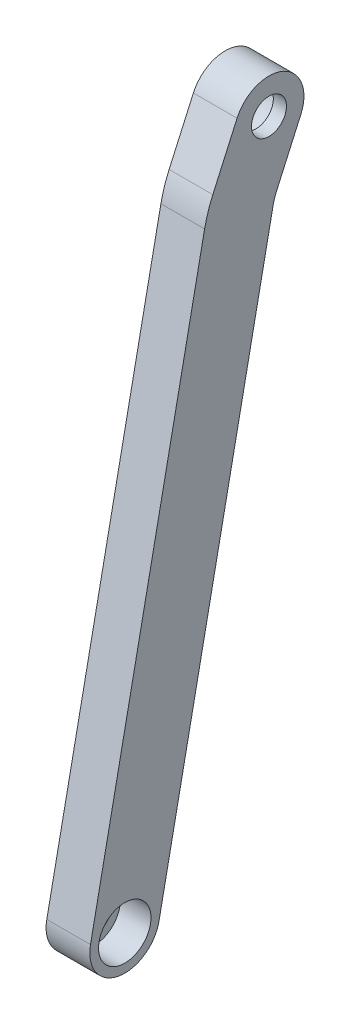
ISO-10303-21;
HEADER;
FILE_DESCRIPTION(('STEP AP214'),'2;1');
FILE_NAME('part.step','',(''),(''),'','','');
FILE_SCHEMA(('AUTOMOTIVE_DESIGN { 1 0 10303 214 1 1 1 1 }'));
ENDSEC;
DATA;
#1=APPLICATION_CONTEXT('core data for automotive mechanical design processes');
#2=APPLICATION_PROTOCOL_DEFINITION('international standard','automotive_design',2000,#1);
#3=PRODUCT_CONTEXT('',#1,'mechanical');
#4=PRODUCT('Part','Part','',(#3));
#5=PRODUCT_RELATED_PRODUCT_CATEGORY('part','',(#4));
#6=PRODUCT_DEFINITION_FORMATION('','',#4);
#7=PRODUCT_DEFINITION_CONTEXT('part definition',#1,'design');
#8=PRODUCT_DEFINITION('design','',#6,#7);
#9=PRODUCT_DEFINITION_SHAPE('','',#8);
#10=(LENGTH_UNIT() NAMED_UNIT(*) SI_UNIT(.MILLI.,.METRE.));
#11=(NAMED_UNIT(*) PLANE_ANGLE_UNIT() SI_UNIT($,.RADIAN.));
#12=(NAMED_UNIT(*) SI_UNIT($,.STERADIAN.) SOLID_ANGLE_UNIT());
#13=UNCERTAINTY_MEASURE_WITH_UNIT(LENGTH_MEASURE(1.E-05),#10,'distance_accuracy_value','');
#14=(GEOMETRIC_REPRESENTATION_CONTEXT(3) GLOBAL_UNCERTAINTY_ASSIGNED_CONTEXT((#13)) GLOBAL_UNIT_ASSIGNED_CONTEXT((#10,
#11,#12)) REPRESENTATION_CONTEXT('',''));
#15=CARTESIAN_POINT('',(0.,0.,0.));
#16=DIRECTION('',(0.,0.,1.));
#17=DIRECTION('',(1.,0.,0.));
#18=AXIS2_PLACEMENT_3D('',#15,#16,#17);
#19=CARTESIAN_POINT('',(-5.65000000000002,-1.63739818421656,-3.64951054065122));
#20=DIRECTION('',(0.,-0.40934954605414,-0.912377635162803));
#21=DIRECTION('',(0.,0.912377635162803,-0.40934954605414));
#22=AXIS2_PLACEMENT_3D('',#19,#20,#21);
#23=PLANE('',#22);
#24=DIRECTION('',(0.,0.912377635162803,-0.40934954605414));
#25=VECTOR('',#24,1.);
#26=CARTESIAN_POINT('',(-0.650000000000012,-1.63739818421656,-3.64951054065122));
#27=LINE('',#26,#25);
#28=CARTESIAN_POINT('',(-0.650000000000012,-7.82477172483871,-0.873468633761289));
#29=VERTEX_POINT('',#28);
#30=CARTESIAN_POINT('',(-0.650000000000012,-1.63739818421658,-3.64951054065121));
#31=VERTEX_POINT('',#30);
#32=EDGE_CURVE('E140',#29,#31,#27,.T.);
#33=ORIENTED_EDGE('',*,*,#32,.F.);
#34=DIRECTION('',(1.,0.,0.));
#35=VECTOR('',#34,1.);
#36=CARTESIAN_POINT('',(-5.65000000000002,-7.82477172483871,-0.873468633761289));
#37=LINE('',#36,#35);
#38=CARTESIAN_POINT('',(-5.65000000000002,-7.82477172483871,-0.873468633761289));
#39=VERTEX_POINT('',#38);
#40=EDGE_CURVE('E11',#39,#29,#37,.T.);
#41=ORIENTED_EDGE('',*,*,#40,.F.);
#42=DIRECTION('',(0.,0.912377635162803,-0.40934954605414));
#43=VECTOR('',#42,1.);
#44=CARTESIAN_POINT('',(-5.65000000000002,-1.63739818421656,-3.64951054065122));
#45=LINE('',#44,#43);
#46=CARTESIAN_POINT('',(-5.65000000000002,-1.63739818421658,-3.64951054065121));
#47=VERTEX_POINT('',#46);
#48=EDGE_CURVE('E159',#39,#47,#45,.T.);
#49=ORIENTED_EDGE('',*,*,#48,.T.);
#50=DIRECTION('',(1.,0.,0.));
#51=VECTOR('',#50,1.);
#52=CARTESIAN_POINT('',(-5.65000000000002,-1.63739818421658,-3.64951054065121));
#53=LINE('',#52,#51);
#54=EDGE_CURVE('E95',#47,#31,#53,.T.);
#55=ORIENTED_EDGE('',*,*,#54,.T.);
#56=EDGE_LOOP('',(#33,#41,#49,#55));
#57=FACE_BOUND('',#56,.T.);
#58=ADVANCED_FACE('F41',(#57),#23,.T.);
#59=CARTESIAN_POINT('',(-5.65000000000002,-10.2399340465581,-6.25649668122183));
#60=DIRECTION('',(1.,0.,0.));
#61=DIRECTION('',(0.,0.,-1.));
#62=AXIS2_PLACEMENT_3D('',#59,#60,#61);
#63=CYLINDRICAL_SURFACE('',#62,5.9);
#64=CARTESIAN_POINT('',(-0.650000000000012,-10.2399340465581,-6.25649668122183));
#65=DIRECTION('',(1.,0.,0.));
#66=DIRECTION('',(0.,0.,-1.));
#67=AXIS2_PLACEMENT_3D('',#64,#65,#66);
#68=CIRCLE('',#67,5.9);
#69=CARTESIAN_POINT('',(-0.650000000000012,-9.06756013629994,-0.474149457598367));
#70=VERTEX_POINT('',#69);
#71=EDGE_CURVE('E86',#29,#70,#68,.T.);
#72=ORIENTED_EDGE('',*,*,#71,.T.);
#73=DIRECTION('',(1.,0.,0.));
#74=VECTOR('',#73,1.);
#75=CARTESIAN_POINT('',(-5.65000000000002,-9.06756013629994,-0.474149457598367));
#76=LINE('',#75,#74);
#77=CARTESIAN_POINT('',(-5.65000000000002,-9.06756013629994,-0.474149457598367));
#78=VERTEX_POINT('',#77);
#79=EDGE_CURVE('E50',#78,#70,#76,.T.);
#80=ORIENTED_EDGE('',*,*,#79,.F.);
#81=CARTESIAN_POINT('',(-5.65000000000002,-10.2399340465581,-6.25649668122183));
#82=DIRECTION('',(1.,0.,0.));
#83=DIRECTION('',(0.,0.,-1.));
#84=AXIS2_PLACEMENT_3D('',#81,#82,#83);
#85=CIRCLE('',#84,5.9);
#86=EDGE_CURVE('E118',#39,#78,#85,.T.);
#87=ORIENTED_EDGE('',*,*,#86,.F.);
#88=ORIENTED_EDGE('',*,*,#40,.T.);
#89=EDGE_LOOP('',(#72,#80,#87,#88));
#90=FACE_BOUND('',#89,.T.);
#91=ADVANCED_FACE('F219',(#90),#63,.F.);
#92=CARTESIAN_POINT('',(-5.65000000000002,-0.450367647555779,-2.22128972136583));
#93=DIRECTION('',(0.,0.198707442416643,0.980058851461603));
#94=DIRECTION('',(0.,-0.980058851461603,0.198707442416643));
#95=AXIS2_PLACEMENT_3D('',#92,#93,#94);
#96=PLANE('',#95);
#97=DIRECTION('',(0.,-0.980058851461603,0.198707442416643));
#98=VECTOR('',#97,1.);
#99=CARTESIAN_POINT('',(-0.650000000000012,-0.450367647555779,-2.22128972136583));
#100=LINE('',#99,#98);
#101=CARTESIAN_POINT('',(-0.650000000000012,-73.4611369825203,12.5816817754848));
#102=VERTEX_POINT('',#101);
#103=EDGE_CURVE('E125',#70,#102,#100,.T.);
#104=ORIENTED_EDGE('',*,*,#103,.T.);
#105=DIRECTION('',(1.,0.,0.));
#106=VECTOR('',#105,1.);
#107=CARTESIAN_POINT('',(-5.65000000000002,-73.4611369825203,12.5816817754848));
#108=LINE('',#107,#106);
#109=CARTESIAN_POINT('',(-5.65000000000002,-73.4611369825203,12.5816817754848));
#110=VERTEX_POINT('',#109);
#111=EDGE_CURVE('E122',#110,#102,#108,.T.);
#112=ORIENTED_EDGE('',*,*,#111,.F.);
#113=DIRECTION('',(0.,-0.980058851461603,0.198707442416643));
#114=VECTOR('',#113,1.);
#115=CARTESIAN_POINT('',(-5.65000000000002,-0.450367647555779,-2.22128972136583));
#116=LINE('',#115,#114);
#117=EDGE_CURVE('E112',#78,#110,#116,.T.);
#118=ORIENTED_EDGE('',*,*,#117,.F.);
#119=ORIENTED_EDGE('',*,*,#79,.T.);
#120=EDGE_LOOP('',(#104,#112,#118,#119));
#121=FACE_BOUND('',#120,.T.);
#122=ADVANCED_FACE('F123',(#121),#96,.F.);
#123=CARTESIAN_POINT('',(-5.65000000000002,-72.6663072128537,16.5019171813312));
#124=DIRECTION('',(1.,0.,0.));
#125=DIRECTION('',(0.,0.,-1.));
#126=AXIS2_PLACEMENT_3D('',#123,#124,#125);
#127=CYLINDRICAL_SURFACE('',#126,4.);
#128=CARTESIAN_POINT('',(-0.650000000000012,-72.6663072128537,16.5019171813312));
#129=DIRECTION('',(1.,0.,0.));
#130=DIRECTION('',(0.,0.,-1.));
#131=AXIS2_PLACEMENT_3D('',#128,#129,#130);
#132=CIRCLE('',#131,4.);
#133=CARTESIAN_POINT('',(-0.650000000000012,-71.8714774431872,20.4221525871776));
#134=VERTEX_POINT('',#133);
#135=EDGE_CURVE('E156',#134,#102,#132,.T.);
#136=ORIENTED_EDGE('',*,*,#135,.F.);
#137=DIRECTION('',(1.,0.,0.));
#138=VECTOR('',#137,1.);
#139=CARTESIAN_POINT('',(-5.65000000000002,-71.8714774431872,20.4221525871776));
#140=LINE('',#139,#138);
#141=CARTESIAN_POINT('',(-5.65000000000002,-71.8714774431872,20.4221525871776));
#142=VERTEX_POINT('',#141);
#143=EDGE_CURVE('E129',#142,#134,#140,.T.);
#144=ORIENTED_EDGE('',*,*,#143,.F.);
#145=CARTESIAN_POINT('',(-5.65000000000002,-72.6663072128537,16.5019171813312));
#146=DIRECTION('',(1.,0.,0.));
#147=DIRECTION('',(0.,0.,-1.));
#148=AXIS2_PLACEMENT_3D('',#145,#146,#147);
#149=CIRCLE('',#148,4.);
#150=EDGE_CURVE('E117',#142,#110,#149,.T.);
#151=ORIENTED_EDGE('',*,*,#150,.T.);
#152=ORIENTED_EDGE('',*,*,#111,.T.);
#153=EDGE_LOOP('',(#136,#144,#151,#152));
#154=FACE_BOUND('',#153,.T.);
#155=ADVANCED_FACE('F131',(#154),#127,.T.);
#156=CARTESIAN_POINT('',(-5.65000000000002,1.13929189177736,5.619181090327));
#157=DIRECTION('',(0.,-0.198707442416643,-0.980058851461603));
#158=DIRECTION('',(0.,0.980058851461603,-0.198707442416643));
#159=AXIS2_PLACEMENT_3D('',#156,#157,#158);
#160=PLANE('',#159);
#161=DIRECTION('',(0.,0.980058851461603,-0.198707442416643));
#162=VECTOR('',#161,1.);
#163=CARTESIAN_POINT('',(-0.650000000000012,1.13929189177736,5.619181090327));
#164=LINE('',#163,#162);
#165=CARTESIAN_POINT('',(-0.650000000000012,-7.4779005969668,7.36632135409445));
#166=VERTEX_POINT('',#165);
#167=EDGE_CURVE('E153',#134,#166,#164,.T.);
#168=ORIENTED_EDGE('',*,*,#167,.T.);
#169=DIRECTION('',(1.,0.,0.));
#170=VECTOR('',#169,1.);
#171=CARTESIAN_POINT('',(-5.65000000000002,-7.4779005969668,7.36632135409445));
#172=LINE('',#171,#170);
#173=CARTESIAN_POINT('',(-5.65000000000002,-7.4779005969668,7.36632135409445));
#174=VERTEX_POINT('',#173);
#175=EDGE_CURVE('E163',#174,#166,#172,.T.);
#176=ORIENTED_EDGE('',*,*,#175,.F.);
#177=DIRECTION('',(0.,0.980058851461603,-0.198707442416643));
#178=VECTOR('',#177,1.);
#179=CARTESIAN_POINT('',(-5.65000000000002,1.13929189177736,5.619181090327));
#180=LINE('',#179,#178);
#181=EDGE_CURVE('E133',#142,#174,#180,.T.);
#182=ORIENTED_EDGE('',*,*,#181,.F.);
#183=ORIENTED_EDGE('',*,*,#143,.T.);
#184=EDGE_LOOP('',(#168,#176,#182,#183));
#185=FACE_BOUND('',#184,.T.);
#186=ADVANCED_FACE('F209',(#185),#160,.F.);
#187=CARTESIAN_POINT('',(-5.65000000000002,-10.2399340465581,-6.25649668122183));
#188=DIRECTION('',(1.,0.,0.));
#189=DIRECTION('',(0.,0.,-1.));
#190=AXIS2_PLACEMENT_3D('',#187,#188,#189);
#191=CYLINDRICAL_SURFACE('',#190,13.9);
#192=CARTESIAN_POINT('',(-0.650000000000012,-10.2399340465581,-6.25649668122183));
#193=DIRECTION('',(1.,0.,0.));
#194=DIRECTION('',(0.,0.,-1.));
#195=AXIS2_PLACEMENT_3D('',#192,#193,#194);
#196=CIRCLE('',#195,13.9);
#197=CARTESIAN_POINT('',(-0.650000000000012,-4.54997535640559,6.42555244754114));
#198=VERTEX_POINT('',#197);
#199=EDGE_CURVE('E150',#198,#166,#196,.T.);
#200=ORIENTED_EDGE('',*,*,#199,.F.);
#201=DIRECTION('',(1.,0.,0.));
#202=VECTOR('',#201,1.);
#203=CARTESIAN_POINT('',(-5.65000000000002,-4.54997535640559,6.42555244754114));
#204=LINE('',#203,#202);
#205=CARTESIAN_POINT('',(-5.65000000000002,-4.54997535640559,6.42555244754114));
#206=VERTEX_POINT('',#205);
#207=EDGE_CURVE('E165',#206,#198,#204,.T.);
#208=ORIENTED_EDGE('',*,*,#207,.F.);
#209=CARTESIAN_POINT('',(-5.65000000000002,-10.2399340465581,-6.25649668122183));
#210=DIRECTION('',(1.,0.,0.));
#211=DIRECTION('',(0.,0.,-1.));
#212=AXIS2_PLACEMENT_3D('',#209,#210,#211);
#213=CIRCLE('',#212,13.9);
#214=EDGE_CURVE('E135',#206,#174,#213,.T.);
#215=ORIENTED_EDGE('',*,*,#214,.T.);
#216=ORIENTED_EDGE('',*,*,#175,.T.);
#217=EDGE_LOOP('',(#200,#208,#215,#216));
#218=FACE_BOUND('',#217,.T.);
#219=ADVANCED_FACE('F198',(#218),#191,.T.);
#220=CARTESIAN_POINT('',(-5.65000000000002,1.63739818421656,3.64951054065121));
#221=DIRECTION('',(0.,0.40934954605414,0.912377635162804));
#222=DIRECTION('',(0.,-0.912377635162804,0.40934954605414));
#223=AXIS2_PLACEMENT_3D('',#220,#221,#222);
#224=PLANE('',#223);
#225=DIRECTION('',(0.,-0.912377635162804,0.40934954605414));
#226=VECTOR('',#225,1.);
#227=CARTESIAN_POINT('',(-0.650000000000012,1.63739818421656,3.64951054065121));
#228=LINE('',#227,#226);
#229=CARTESIAN_POINT('',(-0.650000000000012,1.63739818421655,3.64951054065121));
#230=VERTEX_POINT('',#229);
#231=EDGE_CURVE('E147',#230,#198,#228,.T.);
#232=ORIENTED_EDGE('',*,*,#231,.F.);
#233=DIRECTION('',(1.,0.,0.));
#234=VECTOR('',#233,1.);
#235=CARTESIAN_POINT('',(-5.65000000000002,1.63739818421655,3.64951054065121));
#236=LINE('',#235,#234);
#237=CARTESIAN_POINT('',(-5.65000000000002,1.63739818421655,3.64951054065121));
#238=VERTEX_POINT('',#237);
#239=EDGE_CURVE('E167',#238,#230,#236,.T.);
#240=ORIENTED_EDGE('',*,*,#239,.F.);
#241=DIRECTION('',(0.,-0.912377635162804,0.40934954605414));
#242=VECTOR('',#241,1.);
#243=CARTESIAN_POINT('',(-5.65000000000002,1.63739818421656,3.64951054065121));
#244=LINE('',#243,#242);
#245=EDGE_CURVE('E192',#238,#206,#244,.T.);
#246=ORIENTED_EDGE('',*,*,#245,.T.);
#247=ORIENTED_EDGE('',*,*,#207,.T.);
#248=EDGE_LOOP('',(#232,#240,#246,#247));
#249=FACE_BOUND('',#248,.T.);
#250=ADVANCED_FACE('F203',(#249),#224,.T.);
#251=CARTESIAN_POINT('',(-5.65000000000002,0.,0.));
#252=DIRECTION('',(1.,0.,0.));
#253=DIRECTION('',(0.,0.,-1.));
#254=AXIS2_PLACEMENT_3D('',#251,#252,#253);
#255=CYLINDRICAL_SURFACE('',#254,4.);
#256=CARTESIAN_POINT('',(-0.650000000000012,0.,0.));
#257=DIRECTION('',(1.,0.,0.));
#258=DIRECTION('',(0.,0.,-1.));
#259=AXIS2_PLACEMENT_3D('',#256,#257,#258);
#260=CIRCLE('',#259,4.);
#261=EDGE_CURVE('E143',#31,#230,#260,.T.);
#262=ORIENTED_EDGE('',*,*,#261,.F.);
#263=ORIENTED_EDGE('',*,*,#54,.F.);
#264=CARTESIAN_POINT('',(-5.65000000000002,0.,0.));
#265=DIRECTION('',(1.,0.,0.));
#266=DIRECTION('',(0.,0.,-1.));
#267=AXIS2_PLACEMENT_3D('',#264,#265,#266);
#268=CIRCLE('',#267,4.);
#269=EDGE_CURVE('E190',#47,#238,#268,.T.);
#270=ORIENTED_EDGE('',*,*,#269,.T.);
#271=ORIENTED_EDGE('',*,*,#239,.T.);
#272=EDGE_LOOP('',(#262,#263,#270,#271));
#273=FACE_BOUND('',#272,.T.);
#274=ADVANCED_FACE('F204',(#273),#255,.T.);
#275=CARTESIAN_POINT('',(-5.65000000000002,0.,0.));
#276=DIRECTION('',(1.,0.,0.));
#277=DIRECTION('',(0.,0.,-1.));
#278=AXIS2_PLACEMENT_3D('',#275,#276,#277);
#279=PLANE('',#278);
#280=CARTESIAN_POINT('',(-5.65000000000002,-72.6663072128537,16.5019171813312));
#281=DIRECTION('',(1.,0.,0.));
#282=DIRECTION('',(0.,0.,-1.));
#283=AXIS2_PLACEMENT_3D('',#280,#281,#282);
#284=CIRCLE('',#283,2.00000000000001);
#285=CARTESIAN_POINT('',(-5.65000000000002,-72.6663072128537,14.5019171813312));
#286=VERTEX_POINT('',#285);
#287=EDGE_CURVE('E264',#286,#286,#284,.T.);
#288=ORIENTED_EDGE('',*,*,#287,.T.);
#289=EDGE_LOOP('',(#288));
#290=FACE_BOUND('',#289,.T.);
#291=CARTESIAN_POINT('',(-5.65000000000002,0.,0.));
#292=DIRECTION('',(1.,0.,0.));
#293=DIRECTION('',(0.,0.,-1.));
#294=AXIS2_PLACEMENT_3D('',#291,#292,#293);
#295=CIRCLE('',#294,3.);
#296=CARTESIAN_POINT('',(-5.65000000000002,0.,3.));
#297=VERTEX_POINT('',#296);
#298=EDGE_CURVE('E171',#297,#297,#295,.T.);
#299=ORIENTED_EDGE('',*,*,#298,.T.);
#300=EDGE_LOOP('',(#299));
#301=FACE_BOUND('',#300,.T.);
#302=ORIENTED_EDGE('',*,*,#48,.F.);
#303=ORIENTED_EDGE('',*,*,#86,.T.);
#304=ORIENTED_EDGE('',*,*,#117,.T.);
#305=ORIENTED_EDGE('',*,*,#150,.F.);
#306=ORIENTED_EDGE('',*,*,#181,.T.);
#307=ORIENTED_EDGE('',*,*,#214,.F.);
#308=ORIENTED_EDGE('',*,*,#245,.F.);
#309=ORIENTED_EDGE('',*,*,#269,.F.);
#310=EDGE_LOOP('',(#302,#303,#304,#305,#306,#307,#308,#309));
#311=FACE_BOUND('',#310,.T.);
#312=ADVANCED_FACE('F115',(#290,#301,#311),#279,.F.);
#313=CARTESIAN_POINT('',(-0.650000000000012,0.,0.));
#314=DIRECTION('',(1.,0.,0.));
#315=DIRECTION('',(0.,0.,-1.));
#316=AXIS2_PLACEMENT_3D('',#313,#314,#315);
#317=PLANE('',#316);
#318=CARTESIAN_POINT('',(-0.650000000000012,-72.6663072128537,16.5019171813312));
#319=DIRECTION('',(1.,0.,0.));
#320=DIRECTION('',(0.,0.,-1.));
#321=AXIS2_PLACEMENT_3D('',#318,#319,#320);
#322=CIRCLE('',#321,3.);
#323=CARTESIAN_POINT('',(-0.650000000000012,-72.6663072128537,13.5019171813312));
#324=VERTEX_POINT('',#323);
#325=EDGE_CURVE('E183',#324,#324,#322,.T.);
#326=ORIENTED_EDGE('',*,*,#325,.F.);
#327=EDGE_LOOP('',(#326));
#328=FACE_BOUND('',#327,.T.);
#329=CARTESIAN_POINT('',(-0.650000000000012,0.,0.));
#330=DIRECTION('',(1.,0.,0.));
#331=DIRECTION('',(0.,0.,-1.));
#332=AXIS2_PLACEMENT_3D('',#329,#330,#331);
#333=CIRCLE('',#332,2.);
#334=CARTESIAN_POINT('',(-0.650000000000012,0.,-2.));
#335=VERTEX_POINT('',#334);
#336=EDGE_CURVE('E172',#335,#335,#333,.T.);
#337=ORIENTED_EDGE('',*,*,#336,.F.);
#338=EDGE_LOOP('',(#337));
#339=FACE_BOUND('',#338,.T.);
#340=ORIENTED_EDGE('',*,*,#32,.T.);
#341=ORIENTED_EDGE('',*,*,#261,.T.);
#342=ORIENTED_EDGE('',*,*,#231,.T.);
#343=ORIENTED_EDGE('',*,*,#199,.T.);
#344=ORIENTED_EDGE('',*,*,#167,.F.);
#345=ORIENTED_EDGE('',*,*,#135,.T.);
#346=ORIENTED_EDGE('',*,*,#103,.F.);
#347=ORIENTED_EDGE('',*,*,#71,.F.);
#348=EDGE_LOOP('',(#340,#341,#342,#343,#344,#345,#346,#347));
#349=FACE_BOUND('',#348,.T.);
#350=ADVANCED_FACE('F206',(#328,#339,#349),#317,.T.);
#351=CARTESIAN_POINT('',(-2.15000000000001,0.,0.));
#352=DIRECTION('',(-1.,0.,0.));
#353=DIRECTION('',(0.,0.,1.));
#354=AXIS2_PLACEMENT_3D('',#351,#352,#353);
#355=CYLINDRICAL_SURFACE('',#354,3.);
#356=CARTESIAN_POINT('',(-2.15000000000001,0.,0.));
#357=DIRECTION('',(1.,0.,0.));
#358=DIRECTION('',(0.,0.,-1.));
#359=AXIS2_PLACEMENT_3D('',#356,#357,#358);
#360=CIRCLE('',#359,3.);
#361=CARTESIAN_POINT('',(-2.15000000000001,0.,3.));
#362=VERTEX_POINT('',#361);
#363=EDGE_CURVE('E144',#362,#362,#360,.T.);
#364=CARTESIAN_POINT('',(-2.15000000000001,0.,3.));
#365=CARTESIAN_POINT('',(-2.18645833333335,0.,3.));
#366=CARTESIAN_POINT('',(-2.22291666666668,0.,3.));
#367=CARTESIAN_POINT('',(-2.29583333333335,0.,3.));
#368=CARTESIAN_POINT('',(-2.33229166666668,0.,3.));
#369=CARTESIAN_POINT('',(-2.40520833333335,0.,3.));
#370=CARTESIAN_POINT('',(-2.44166666666668,0.,3.));
#371=CARTESIAN_POINT('',(-2.51458333333335,0.,3.));
#372=CARTESIAN_POINT('',(-2.55104166666668,0.,3.));
#373=CARTESIAN_POINT('',(-2.62395833333335,0.,3.));
#374=CARTESIAN_POINT('',(-2.66041666666668,0.,3.));
#375=CARTESIAN_POINT('',(-2.73333333333335,0.,3.));
#376=CARTESIAN_POINT('',(-2.76979166666668,0.,3.));
#377=CARTESIAN_POINT('',(-2.84270833333335,0.,3.));
#378=CARTESIAN_POINT('',(-2.87916666666668,0.,3.));
#379=CARTESIAN_POINT('',(-2.95208333333335,0.,3.));
#380=CARTESIAN_POINT('',(-2.98854166666668,0.,3.));
#381=CARTESIAN_POINT('',(-3.06145833333335,0.,3.));
#382=CARTESIAN_POINT('',(-3.09791666666668,0.,3.));
#383=CARTESIAN_POINT('',(-3.17083333333335,0.,3.));
#384=CARTESIAN_POINT('',(-3.20729166666668,0.,3.));
#385=CARTESIAN_POINT('',(-3.28020833333335,0.,3.));
#386=CARTESIAN_POINT('',(-3.31666666666668,0.,3.));
#387=CARTESIAN_POINT('',(-3.38958333333335,0.,3.));
#388=CARTESIAN_POINT('',(-3.42604166666668,0.,3.));
#389=CARTESIAN_POINT('',(-3.49895833333335,0.,3.));
#390=CARTESIAN_POINT('',(-3.53541666666668,0.,3.));
#391=CARTESIAN_POINT('',(-3.60833333333335,0.,3.));
#392=CARTESIAN_POINT('',(-3.64479166666668,0.,3.));
#393=CARTESIAN_POINT('',(-3.71770833333335,0.,3.));
#394=CARTESIAN_POINT('',(-3.75416666666668,0.,3.));
#395=CARTESIAN_POINT('',(-3.82708333333335,0.,3.));
#396=CARTESIAN_POINT('',(-3.86354166666668,0.,3.));
#397=CARTESIAN_POINT('',(-3.93645833333335,0.,3.));
#398=CARTESIAN_POINT('',(-3.97291666666668,0.,3.));
#399=CARTESIAN_POINT('',(-4.04583333333335,0.,3.));
#400=CARTESIAN_POINT('',(-4.08229166666668,0.,3.));
#401=CARTESIAN_POINT('',(-4.15520833333335,0.,3.));
#402=CARTESIAN_POINT('',(-4.19166666666668,0.,3.));
#403=CARTESIAN_POINT('',(-4.26458333333335,0.,3.));
#404=CARTESIAN_POINT('',(-4.30104166666668,0.,3.));
#405=CARTESIAN_POINT('',(-4.37395833333335,0.,3.));
#406=CARTESIAN_POINT('',(-4.41041666666668,0.,3.));
#407=CARTESIAN_POINT('',(-4.48333333333335,0.,3.));
#408=CARTESIAN_POINT('',(-4.51979166666668,0.,3.));
#409=CARTESIAN_POINT('',(-4.59270833333335,0.,3.));
#410=CARTESIAN_POINT('',(-4.62916666666668,0.,3.));
#411=CARTESIAN_POINT('',(-4.70208333333335,0.,3.));
#412=CARTESIAN_POINT('',(-4.73854166666668,0.,3.));
#413=CARTESIAN_POINT('',(-4.81145833333335,0.,3.));
#414=CARTESIAN_POINT('',(-4.84791666666668,0.,3.));
#415=CARTESIAN_POINT('',(-4.92083333333335,0.,3.));
#416=CARTESIAN_POINT('',(-4.95729166666668,0.,3.));
#417=CARTESIAN_POINT('',(-5.03020833333335,0.,3.));
#418=CARTESIAN_POINT('',(-5.06666666666668,0.,3.));
#419=CARTESIAN_POINT('',(-5.13958333333335,0.,3.));
#420=CARTESIAN_POINT('',(-5.17604166666668,0.,3.));
#421=CARTESIAN_POINT('',(-5.24895833333335,0.,3.));
#422=CARTESIAN_POINT('',(-5.28541666666668,0.,3.));
#423=CARTESIAN_POINT('',(-5.35833333333335,0.,3.));
#424=CARTESIAN_POINT('',(-5.39479166666668,0.,3.));
#425=CARTESIAN_POINT('',(-5.46770833333335,0.,3.));
#426=CARTESIAN_POINT('',(-5.50416666666668,0.,3.));
#427=CARTESIAN_POINT('',(-5.57708333333335,0.,3.));
#428=CARTESIAN_POINT('',(-5.61354166666668,0.,3.));
#429=CARTESIAN_POINT('',(-5.65000000000002,0.,3.));
#430=B_SPLINE_CURVE_WITH_KNOTS('',3,(#364,#365,#366,#367,#368,#369,#370,#371,#372,#373,#374,
#375,#376,#377,#378,#379,#380,#381,#382,#383,#384,#385,#386,#387,#388,#389,#390,#391,#392,#393,
#394,#395,#396,#397,#398,#399,#400,#401,#402,#403,#404,#405,#406,#407,#408,#409,#410,#411,#412,
#413,#414,#415,#416,#417,#418,#419,#420,#421,#422,#423,#424,#425,#426,#427,#428,#429),
.UNSPECIFIED.,.F.,.F.,(4,2,2,2,2,2,2,2,2,2,2,2,2,2,2,2,2,2,2,2,2,2,2,2,2,2,2,2,2,2,2,2,4),(0.,
0.109375,0.21875,0.328125,0.4375,0.546875,0.65625,0.765625,0.875,0.984375,1.09375,1.203125,
1.3125,1.421875,1.53125,1.640625,1.75,1.859375,1.96875,2.078125,2.1875,2.296875,2.40625,
2.515625,2.625,2.734375,2.84375,2.953125,3.0625,3.171875,3.28125,3.390625,3.5),.UNSPECIFIED.);
#431=EDGE_CURVE('BSEAM231',#362,#297,#430,.T.);
#432=ORIENTED_EDGE('',*,*,#363,.T.);
#433=ORIENTED_EDGE('',*,*,#298,.F.);
#434=ORIENTED_EDGE('',*,*,#431,.T.);
#435=ORIENTED_EDGE('',*,*,#431,.F.);
#436=EDGE_LOOP('',(#432,#434,#433,#435));
#437=FACE_BOUND('',#436,.T.);
#438=ADVANCED_FACE('F231',(#437),#355,.F.);
#439=CARTESIAN_POINT('',(-2.15000000000001,0.,0.));
#440=DIRECTION('',(1.,0.,0.));
#441=DIRECTION('',(0.,0.,-1.));
#442=AXIS2_PLACEMENT_3D('',#439,#440,#441);
#443=PLANE('',#442);
#444=CARTESIAN_POINT('',(-2.15000000000001,0.,0.));
#445=DIRECTION('',(1.,0.,0.));
#446=DIRECTION('',(0.,0.,-1.));
#447=AXIS2_PLACEMENT_3D('',#444,#445,#446);
#448=CIRCLE('',#447,2.);
#449=CARTESIAN_POINT('',(-2.15000000000001,0.,-2.));
#450=VERTEX_POINT('',#449);
#451=EDGE_CURVE('E169',#450,#450,#448,.F.);
#452=ORIENTED_EDGE('',*,*,#451,.F.);
#453=EDGE_LOOP('',(#452));
#454=FACE_BOUND('',#453,.T.);
#455=ORIENTED_EDGE('',*,*,#363,.F.);
#456=EDGE_LOOP('',(#455));
#457=FACE_BOUND('',#456,.T.);
#458=ADVANCED_FACE('F238',(#454,#457),#443,.F.);
#459=CARTESIAN_POINT('',(-0.650000000000012,0.,0.));
#460=DIRECTION('',(-1.,0.,0.));
#461=DIRECTION('',(0.,0.,1.));
#462=AXIS2_PLACEMENT_3D('',#459,#460,#461);
#463=CYLINDRICAL_SURFACE('',#462,2.);
#464=ORIENTED_EDGE('',*,*,#336,.T.);
#465=EDGE_LOOP('',(#464));
#466=FACE_BOUND('',#465,.T.);
#467=ORIENTED_EDGE('',*,*,#451,.T.);
#468=EDGE_LOOP('',(#467));
#469=FACE_BOUND('',#468,.T.);
#470=ADVANCED_FACE('F242',(#466,#469),#463,.F.);
#471=CARTESIAN_POINT('',(-4.15000000000001,-72.6663072128537,16.5019171813312));
#472=DIRECTION('',(1.,0.,0.));
#473=DIRECTION('',(0.,0.,-1.));
#474=AXIS2_PLACEMENT_3D('',#471,#472,#473);
#475=CYLINDRICAL_SURFACE('',#474,3.);
#476=CARTESIAN_POINT('',(-4.15000000000001,-72.6663072128537,16.5019171813312));
#477=DIRECTION('',(1.,0.,0.));
#478=DIRECTION('',(0.,0.,-1.));
#479=AXIS2_PLACEMENT_3D('',#476,#477,#478);
#480=CIRCLE('',#479,3.);
#481=CARTESIAN_POINT('',(-4.15000000000002,-72.6663072128537,13.5019171813312));
#482=VERTEX_POINT('',#481);
#483=EDGE_CURVE('E178',#482,#482,#480,.T.);
#484=CARTESIAN_POINT('',(-4.15000000000002,-72.6663072128537,13.5019171813312));
#485=CARTESIAN_POINT('',(-4.11354166666668,-72.6663072128537,13.5019171813312));
#486=CARTESIAN_POINT('',(-4.07708333333335,-72.6663072128537,13.5019171813312));
#487=CARTESIAN_POINT('',(-4.00416666666668,-72.6663072128537,13.5019171813312));
#488=CARTESIAN_POINT('',(-3.96770833333335,-72.6663072128537,13.5019171813312));
#489=CARTESIAN_POINT('',(-3.89479166666668,-72.6663072128537,13.5019171813312));
#490=CARTESIAN_POINT('',(-3.85833333333335,-72.6663072128537,13.5019171813312));
#491=CARTESIAN_POINT('',(-3.78541666666668,-72.6663072128537,13.5019171813312));
#492=CARTESIAN_POINT('',(-3.74895833333335,-72.6663072128537,13.5019171813312));
#493=CARTESIAN_POINT('',(-3.67604166666668,-72.6663072128537,13.5019171813312));
#494=CARTESIAN_POINT('',(-3.63958333333335,-72.6663072128537,13.5019171813312));
#495=CARTESIAN_POINT('',(-3.56666666666668,-72.6663072128537,13.5019171813312));
#496=CARTESIAN_POINT('',(-3.53020833333335,-72.6663072128537,13.5019171813312));
#497=CARTESIAN_POINT('',(-3.45729166666668,-72.6663072128537,13.5019171813312));
#498=CARTESIAN_POINT('',(-3.42083333333335,-72.6663072128537,13.5019171813312));
#499=CARTESIAN_POINT('',(-3.34791666666668,-72.6663072128537,13.5019171813312));
#500=CARTESIAN_POINT('',(-3.31145833333335,-72.6663072128537,13.5019171813312));
#501=CARTESIAN_POINT('',(-3.23854166666668,-72.6663072128537,13.5019171813312));
#502=CARTESIAN_POINT('',(-3.20208333333335,-72.6663072128537,13.5019171813312));
#503=CARTESIAN_POINT('',(-3.12916666666668,-72.6663072128537,13.5019171813312));
#504=CARTESIAN_POINT('',(-3.09270833333335,-72.6663072128537,13.5019171813312));
#505=CARTESIAN_POINT('',(-3.01979166666668,-72.6663072128537,13.5019171813312));
#506=CARTESIAN_POINT('',(-2.98333333333335,-72.6663072128537,13.5019171813312));
#507=CARTESIAN_POINT('',(-2.91041666666668,-72.6663072128537,13.5019171813312));
#508=CARTESIAN_POINT('',(-2.87395833333335,-72.6663072128537,13.5019171813312));
#509=CARTESIAN_POINT('',(-2.80104166666668,-72.6663072128537,13.5019171813312));
#510=CARTESIAN_POINT('',(-2.76458333333335,-72.6663072128537,13.5019171813312));
#511=CARTESIAN_POINT('',(-2.69166666666668,-72.6663072128537,13.5019171813312));
#512=CARTESIAN_POINT('',(-2.65520833333335,-72.6663072128537,13.5019171813312));
#513=CARTESIAN_POINT('',(-2.58229166666668,-72.6663072128537,13.5019171813312));
#514=CARTESIAN_POINT('',(-2.54583333333335,-72.6663072128537,13.5019171813312));
#515=CARTESIAN_POINT('',(-2.47291666666668,-72.6663072128537,13.5019171813312));
#516=CARTESIAN_POINT('',(-2.43645833333335,-72.6663072128537,13.5019171813312));
#517=CARTESIAN_POINT('',(-2.36354166666668,-72.6663072128537,13.5019171813312));
#518=CARTESIAN_POINT('',(-2.32708333333335,-72.6663072128537,13.5019171813312));
#519=CARTESIAN_POINT('',(-2.25416666666668,-72.6663072128537,13.5019171813312));
#520=CARTESIAN_POINT('',(-2.21770833333335,-72.6663072128537,13.5019171813312));
#521=CARTESIAN_POINT('',(-2.14479166666668,-72.6663072128537,13.5019171813312));
#522=CARTESIAN_POINT('',(-2.10833333333335,-72.6663072128537,13.5019171813312));
#523=CARTESIAN_POINT('',(-2.03541666666668,-72.6663072128537,13.5019171813312));
#524=CARTESIAN_POINT('',(-1.99895833333335,-72.6663072128537,13.5019171813312));
#525=CARTESIAN_POINT('',(-1.92604166666668,-72.6663072128537,13.5019171813312));
#526=CARTESIAN_POINT('',(-1.88958333333335,-72.6663072128537,13.5019171813312));
#527=CARTESIAN_POINT('',(-1.81666666666668,-72.6663072128537,13.5019171813312));
#528=CARTESIAN_POINT('',(-1.78020833333335,-72.6663072128537,13.5019171813312));
#529=CARTESIAN_POINT('',(-1.70729166666668,-72.6663072128537,13.5019171813312));
#530=CARTESIAN_POINT('',(-1.67083333333335,-72.6663072128537,13.5019171813312));
#531=CARTESIAN_POINT('',(-1.59791666666668,-72.6663072128537,13.5019171813312));
#532=CARTESIAN_POINT('',(-1.56145833333335,-72.6663072128537,13.5019171813312));
#533=CARTESIAN_POINT('',(-1.48854166666668,-72.6663072128537,13.5019171813312));
#534=CARTESIAN_POINT('',(-1.45208333333335,-72.6663072128537,13.5019171813312));
#535=CARTESIAN_POINT('',(-1.37916666666668,-72.6663072128537,13.5019171813312));
#536=CARTESIAN_POINT('',(-1.34270833333335,-72.6663072128537,13.5019171813312));
#537=CARTESIAN_POINT('',(-1.26979166666668,-72.6663072128537,13.5019171813312));
#538=CARTESIAN_POINT('',(-1.23333333333335,-72.6663072128537,13.5019171813312));
#539=CARTESIAN_POINT('',(-1.16041666666668,-72.6663072128537,13.5019171813312));
#540=CARTESIAN_POINT('',(-1.12395833333335,-72.6663072128537,13.5019171813312));
#541=CARTESIAN_POINT('',(-1.05104166666668,-72.6663072128537,13.5019171813312));
#542=CARTESIAN_POINT('',(-1.01458333333335,-72.6663072128537,13.5019171813312));
#543=CARTESIAN_POINT('',(-0.941666666666679,-72.6663072128537,13.5019171813312));
#544=CARTESIAN_POINT('',(-0.905208333333346,-72.6663072128537,13.5019171813312));
#545=CARTESIAN_POINT('',(-0.832291666666679,-72.6663072128537,13.5019171813312));
#546=CARTESIAN_POINT('',(-0.795833333333345,-72.6663072128537,13.5019171813312));
#547=CARTESIAN_POINT('',(-0.722916666666679,-72.6663072128537,13.5019171813312));
#548=CARTESIAN_POINT('',(-0.686458333333345,-72.6663072128537,13.5019171813312));
#549=CARTESIAN_POINT('',(-0.650000000000012,-72.6663072128537,13.5019171813312));
#550=B_SPLINE_CURVE_WITH_KNOTS('',3,(#484,#485,#486,#487,#488,#489,#490,#491,#492,#493,#494,
#495,#496,#497,#498,#499,#500,#501,#502,#503,#504,#505,#506,#507,#508,#509,#510,#511,#512,#513,
#514,#515,#516,#517,#518,#519,#520,#521,#522,#523,#524,#525,#526,#527,#528,#529,#530,#531,#532,
#533,#534,#535,#536,#537,#538,#539,#540,#541,#542,#543,#544,#545,#546,#547,#548,#549),
.UNSPECIFIED.,.F.,.F.,(4,2,2,2,2,2,2,2,2,2,2,2,2,2,2,2,2,2,2,2,2,2,2,2,2,2,2,2,2,2,2,2,4),(0.,
0.109375000000001,0.218750000000001,0.328125000000001,0.437500000000001,0.546875000000001,
0.656250000000001,0.765625000000001,0.875000000000001,0.984375000000001,1.09375,1.203125,1.3125,
1.421875,1.53125,1.640625,1.75,1.859375,1.96875,2.078125,2.1875,2.296875,2.40625,2.515625,2.625,
2.734375,2.84375,2.953125,3.0625,3.171875,3.28125,3.390625,3.5),.UNSPECIFIED.);
#551=EDGE_CURVE('BSEAM246',#482,#324,#550,.T.);
#552=ORIENTED_EDGE('',*,*,#483,.F.);
#553=ORIENTED_EDGE('',*,*,#325,.T.);
#554=ORIENTED_EDGE('',*,*,#551,.T.);
#555=ORIENTED_EDGE('',*,*,#551,.F.);
#556=EDGE_LOOP('',(#552,#554,#553,#555));
#557=FACE_BOUND('',#556,.T.);
#558=ADVANCED_FACE('F246',(#557),#475,.F.);
#559=CARTESIAN_POINT('',(-4.15000000000001,0.,0.));
#560=DIRECTION('',(1.,0.,0.));
#561=DIRECTION('',(0.,0.,-1.));
#562=AXIS2_PLACEMENT_3D('',#559,#560,#561);
#563=PLANE('',#562);
#564=CARTESIAN_POINT('',(-4.15000000000001,-72.6663072128537,16.5019171813312));
#565=DIRECTION('',(1.,0.,0.));
#566=DIRECTION('',(0.,0.,-1.));
#567=AXIS2_PLACEMENT_3D('',#564,#565,#566);
#568=CIRCLE('',#567,2.00000000000001);
#569=CARTESIAN_POINT('',(-4.15000000000001,-72.6663072128537,14.5019171813312));
#570=VERTEX_POINT('',#569);
#571=EDGE_CURVE('E44',#570,#570,#568,.T.);
#572=ORIENTED_EDGE('',*,*,#571,.F.);
#573=EDGE_LOOP('',(#572));
#574=FACE_BOUND('',#573,.T.);
#575=ORIENTED_EDGE('',*,*,#483,.T.);
#576=EDGE_LOOP('',(#575));
#577=FACE_BOUND('',#576,.T.);
#578=ADVANCED_FACE('F249',(#574,#577),#563,.T.);
#579=CARTESIAN_POINT('',(-5.65000000000002,-72.6663072128537,16.5019171813312));
#580=DIRECTION('',(1.,0.,0.));
#581=DIRECTION('',(0.,0.,-1.));
#582=AXIS2_PLACEMENT_3D('',#579,#580,#581);
#583=CYLINDRICAL_SURFACE('',#582,2.00000000000001);
#584=ORIENTED_EDGE('',*,*,#571,.T.);
#585=EDGE_LOOP('',(#584));
#586=FACE_BOUND('',#585,.T.);
#587=ORIENTED_EDGE('',*,*,#287,.F.);
#588=EDGE_LOOP('',(#587));
#589=FACE_BOUND('',#588,.T.);
#590=ADVANCED_FACE('F253',(#586,#589),#583,.F.);
#591=CLOSED_SHELL('',(#58,#91,#122,#155,#186,#219,#250,#274,#312,#350,#438,#458,#470,#558,#578,#590));
#592=MANIFOLD_SOLID_BREP('B2',#591);
#593=ADVANCED_BREP_SHAPE_REPRESENTATION('',(#18,#592),#14);
#594=SHAPE_DEFINITION_REPRESENTATION(#9,#593);
ENDSEC;
END-ISO-10303-21;
